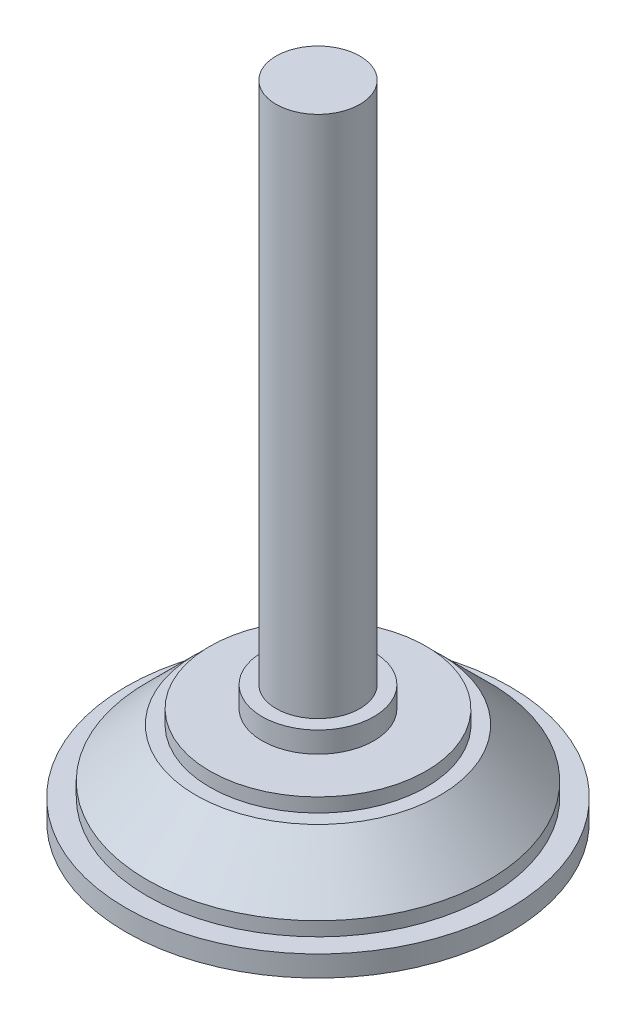
ISO-10303-21;
HEADER;
FILE_DESCRIPTION(('STEP AP214'),'2;1');
FILE_NAME('part.step','',(''),(''),'','','');
FILE_SCHEMA(('AUTOMOTIVE_DESIGN { 1 0 10303 214 1 1 1 1 }'));
ENDSEC;
DATA;
#1=APPLICATION_CONTEXT('core data for automotive mechanical design processes');
#2=APPLICATION_PROTOCOL_DEFINITION('international standard','automotive_design',2000,#1);
#3=PRODUCT_CONTEXT('',#1,'mechanical');
#4=PRODUCT('Part','Part','',(#3));
#5=PRODUCT_RELATED_PRODUCT_CATEGORY('part','',(#4));
#6=PRODUCT_DEFINITION_FORMATION('','',#4);
#7=PRODUCT_DEFINITION_CONTEXT('part definition',#1,'design');
#8=PRODUCT_DEFINITION('design','',#6,#7);
#9=PRODUCT_DEFINITION_SHAPE('','',#8);
#10=(LENGTH_UNIT() NAMED_UNIT(*) SI_UNIT(.MILLI.,.METRE.));
#11=(NAMED_UNIT(*) PLANE_ANGLE_UNIT() SI_UNIT($,.RADIAN.));
#12=(NAMED_UNIT(*) SI_UNIT($,.STERADIAN.) SOLID_ANGLE_UNIT());
#13=UNCERTAINTY_MEASURE_WITH_UNIT(LENGTH_MEASURE(1.E-05),#10,'distance_accuracy_value','');
#14=(GEOMETRIC_REPRESENTATION_CONTEXT(3) GLOBAL_UNCERTAINTY_ASSIGNED_CONTEXT((#13)) GLOBAL_UNIT_ASSIGNED_CONTEXT((#10,
#11,#12)) REPRESENTATION_CONTEXT('',''));
#15=CARTESIAN_POINT('',(0.,0.,0.));
#16=DIRECTION('',(0.,0.,1.));
#17=DIRECTION('',(1.,0.,0.));
#18=AXIS2_PLACEMENT_3D('',#15,#16,#17);
#19=CARTESIAN_POINT('',(0.,0.,0.));
#20=DIRECTION('',(0.,1.,0.));
#21=DIRECTION('',(0.,0.,1.));
#22=AXIS2_PLACEMENT_3D('',#19,#20,#21);
#23=PLANE('',#22);
#24=CARTESIAN_POINT('',(0.,0.,0.));
#25=DIRECTION('',(0.,1.,0.));
#26=DIRECTION('',(0.,0.,1.));
#27=AXIS2_PLACEMENT_3D('',#24,#25,#26);
#28=CIRCLE('',#27,27.5);
#29=CARTESIAN_POINT('',(0.,0.,27.5));
#30=VERTEX_POINT('',#29);
#31=EDGE_CURVE('E10',#30,#30,#28,.T.);
#32=ORIENTED_EDGE('',*,*,#31,.F.);
#33=EDGE_LOOP('',(#32));
#34=FACE_BOUND('',#33,.T.);
#35=ADVANCED_FACE('F34',(#34),#23,.F.);
#36=CARTESIAN_POINT('',(0.,92.,0.));
#37=DIRECTION('',(0.,1.,0.));
#38=DIRECTION('',(0.,0.,1.));
#39=AXIS2_PLACEMENT_3D('',#36,#37,#38);
#40=CYLINDRICAL_SURFACE('',#39,27.5);
#41=CARTESIAN_POINT('',(0.,3.,0.));
#42=DIRECTION('',(0.,1.,0.));
#43=DIRECTION('',(0.,0.,1.));
#44=AXIS2_PLACEMENT_3D('',#41,#42,#43);
#45=CIRCLE('',#44,27.5);
#46=CARTESIAN_POINT('',(0.,3.,27.5));
#47=VERTEX_POINT('',#46);
#48=EDGE_CURVE('E40',#47,#47,#45,.T.);
#49=ORIENTED_EDGE('',*,*,#48,.F.);
#50=EDGE_LOOP('',(#49));
#51=FACE_BOUND('',#50,.T.);
#52=ORIENTED_EDGE('',*,*,#31,.T.);
#53=EDGE_LOOP('',(#52));
#54=FACE_BOUND('',#53,.T.);
#55=ADVANCED_FACE('F127',(#51,#54),#40,.T.);
#56=CARTESIAN_POINT('',(27.5,3.,0.));
#57=DIRECTION('',(0.,-1.,0.));
#58=DIRECTION('',(0.,0.,-1.));
#59=AXIS2_PLACEMENT_3D('',#56,#57,#58);
#60=PLANE('',#59);
#61=CARTESIAN_POINT('',(0.,3.,0.));
#62=DIRECTION('',(0.,1.,0.));
#63=DIRECTION('',(0.,0.,1.));
#64=AXIS2_PLACEMENT_3D('',#61,#62,#63);
#65=CIRCLE('',#64,24.5);
#66=CARTESIAN_POINT('',(0.,3.,24.5));
#67=VERTEX_POINT('',#66);
#68=EDGE_CURVE('E44',#67,#67,#65,.T.);
#69=ORIENTED_EDGE('',*,*,#68,.F.);
#70=EDGE_LOOP('',(#69));
#71=FACE_BOUND('',#70,.T.);
#72=ORIENTED_EDGE('',*,*,#48,.T.);
#73=EDGE_LOOP('',(#72));
#74=FACE_BOUND('',#73,.T.);
#75=ADVANCED_FACE('F122',(#71,#74),#60,.F.);
#76=CARTESIAN_POINT('',(0.,92.,0.));
#77=DIRECTION('',(0.,1.,0.));
#78=DIRECTION('',(0.,0.,1.));
#79=AXIS2_PLACEMENT_3D('',#76,#77,#78);
#80=CYLINDRICAL_SURFACE('',#79,24.5);
#81=CARTESIAN_POINT('',(0.,5.,0.));
#82=DIRECTION('',(0.,1.,0.));
#83=DIRECTION('',(0.,0.,1.));
#84=AXIS2_PLACEMENT_3D('',#81,#82,#83);
#85=CIRCLE('',#84,24.5);
#86=CARTESIAN_POINT('',(0.,5.,24.5));
#87=VERTEX_POINT('',#86);
#88=EDGE_CURVE('E48',#87,#87,#85,.T.);
#89=ORIENTED_EDGE('',*,*,#88,.F.);
#90=EDGE_LOOP('',(#89));
#91=FACE_BOUND('',#90,.T.);
#92=ORIENTED_EDGE('',*,*,#68,.T.);
#93=EDGE_LOOP('',(#92));
#94=FACE_BOUND('',#93,.T.);
#95=ADVANCED_FACE('F116',(#91,#94),#80,.T.);
#96=CARTESIAN_POINT('',(0.,5.,0.));
#97=DIRECTION('',(0.,-1.,0.));
#98=DIRECTION('',(0.,0.,-1.));
#99=AXIS2_PLACEMENT_3D('',#96,#97,#98);
#100=CONICAL_SURFACE('',#99,24.5,0.785398163397451);
#101=CARTESIAN_POINT('',(0.,12.,0.));
#102=DIRECTION('',(0.,1.,0.));
#103=DIRECTION('',(0.,0.,1.));
#104=AXIS2_PLACEMENT_3D('',#101,#102,#103);
#105=CIRCLE('',#104,17.5);
#106=CARTESIAN_POINT('',(0.,12.,17.5));
#107=VERTEX_POINT('',#106);
#108=EDGE_CURVE('E53',#107,#107,#105,.T.);
#109=ORIENTED_EDGE('',*,*,#108,.F.);
#110=EDGE_LOOP('',(#109));
#111=FACE_BOUND('',#110,.T.);
#112=ORIENTED_EDGE('',*,*,#88,.T.);
#113=EDGE_LOOP('',(#112));
#114=FACE_BOUND('',#113,.T.);
#115=ADVANCED_FACE('F110',(#111,#114),#100,.T.);
#116=CARTESIAN_POINT('',(17.5,12.,0.));
#117=DIRECTION('',(0.,-1.,0.));
#118=DIRECTION('',(0.,0.,-1.));
#119=AXIS2_PLACEMENT_3D('',#116,#117,#118);
#120=PLANE('',#119);
#121=CARTESIAN_POINT('',(0.,12.,0.));
#122=DIRECTION('',(0.,1.,0.));
#123=DIRECTION('',(0.,0.,1.));
#124=AXIS2_PLACEMENT_3D('',#121,#122,#123);
#125=CIRCLE('',#124,15.5);
#126=CARTESIAN_POINT('',(0.,12.,15.5));
#127=VERTEX_POINT('',#126);
#128=EDGE_CURVE('E56',#127,#127,#125,.T.);
#129=ORIENTED_EDGE('',*,*,#128,.F.);
#130=EDGE_LOOP('',(#129));
#131=FACE_BOUND('',#130,.T.);
#132=ORIENTED_EDGE('',*,*,#108,.T.);
#133=EDGE_LOOP('',(#132));
#134=FACE_BOUND('',#133,.T.);
#135=ADVANCED_FACE('F104',(#131,#134),#120,.F.);
#136=CARTESIAN_POINT('',(0.,92.,0.));
#137=DIRECTION('',(0.,1.,0.));
#138=DIRECTION('',(0.,0.,1.));
#139=AXIS2_PLACEMENT_3D('',#136,#137,#138);
#140=CYLINDRICAL_SURFACE('',#139,15.5);
#141=CARTESIAN_POINT('',(0.,14.,0.));
#142=DIRECTION('',(0.,1.,0.));
#143=DIRECTION('',(0.,0.,1.));
#144=AXIS2_PLACEMENT_3D('',#141,#142,#143);
#145=CIRCLE('',#144,15.5);
#146=CARTESIAN_POINT('',(0.,14.,15.5));
#147=VERTEX_POINT('',#146);
#148=EDGE_CURVE('E59',#147,#147,#145,.T.);
#149=ORIENTED_EDGE('',*,*,#148,.F.);
#150=EDGE_LOOP('',(#149));
#151=FACE_BOUND('',#150,.T.);
#152=ORIENTED_EDGE('',*,*,#128,.T.);
#153=EDGE_LOOP('',(#152));
#154=FACE_BOUND('',#153,.T.);
#155=ADVANCED_FACE('F98',(#151,#154),#140,.T.);
#156=CARTESIAN_POINT('',(15.5,14.,0.));
#157=DIRECTION('',(0.,-1.,0.));
#158=DIRECTION('',(0.,0.,-1.));
#159=AXIS2_PLACEMENT_3D('',#156,#157,#158);
#160=PLANE('',#159);
#161=CARTESIAN_POINT('',(0.,14.,0.));
#162=DIRECTION('',(0.,1.,0.));
#163=DIRECTION('',(0.,0.,1.));
#164=AXIS2_PLACEMENT_3D('',#161,#162,#163);
#165=CIRCLE('',#164,8.00000000000001);
#166=CARTESIAN_POINT('',(0.,14.,8.00000000000001));
#167=VERTEX_POINT('',#166);
#168=EDGE_CURVE('E62',#167,#167,#165,.T.);
#169=ORIENTED_EDGE('',*,*,#168,.F.);
#170=EDGE_LOOP('',(#169));
#171=FACE_BOUND('',#170,.T.);
#172=ORIENTED_EDGE('',*,*,#148,.T.);
#173=EDGE_LOOP('',(#172));
#174=FACE_BOUND('',#173,.T.);
#175=ADVANCED_FACE('F92',(#171,#174),#160,.F.);
#176=CARTESIAN_POINT('',(0.,92.,0.));
#177=DIRECTION('',(0.,1.,0.));
#178=DIRECTION('',(0.,0.,1.));
#179=AXIS2_PLACEMENT_3D('',#176,#177,#178);
#180=CYLINDRICAL_SURFACE('',#179,8.00000000000001);
#181=CARTESIAN_POINT('',(0.,17.,0.));
#182=DIRECTION('',(0.,1.,0.));
#183=DIRECTION('',(0.,0.,1.));
#184=AXIS2_PLACEMENT_3D('',#181,#182,#183);
#185=CIRCLE('',#184,8.00000000000001);
#186=CARTESIAN_POINT('',(0.,17.,8.00000000000001));
#187=VERTEX_POINT('',#186);
#188=EDGE_CURVE('E65',#187,#187,#185,.T.);
#189=ORIENTED_EDGE('',*,*,#188,.F.);
#190=EDGE_LOOP('',(#189));
#191=FACE_BOUND('',#190,.T.);
#192=ORIENTED_EDGE('',*,*,#168,.T.);
#193=EDGE_LOOP('',(#192));
#194=FACE_BOUND('',#193,.T.);
#195=ADVANCED_FACE('F86',(#191,#194),#180,.T.);
#196=CARTESIAN_POINT('',(8.00000000000001,17.,0.));
#197=DIRECTION('',(0.,-1.,0.));
#198=DIRECTION('',(0.,0.,-1.));
#199=AXIS2_PLACEMENT_3D('',#196,#197,#198);
#200=PLANE('',#199);
#201=CARTESIAN_POINT('',(0.,17.,0.));
#202=DIRECTION('',(0.,1.,0.));
#203=DIRECTION('',(0.,0.,1.));
#204=AXIS2_PLACEMENT_3D('',#201,#202,#203);
#205=CIRCLE('',#204,6.00000000000001);
#206=CARTESIAN_POINT('',(0.,17.,6.00000000000001));
#207=VERTEX_POINT('',#206);
#208=EDGE_CURVE('E68',#207,#207,#205,.T.);
#209=ORIENTED_EDGE('',*,*,#208,.F.);
#210=EDGE_LOOP('',(#209));
#211=FACE_BOUND('',#210,.T.);
#212=ORIENTED_EDGE('',*,*,#188,.T.);
#213=EDGE_LOOP('',(#212));
#214=FACE_BOUND('',#213,.T.);
#215=ADVANCED_FACE('F80',(#211,#214),#200,.F.);
#216=CARTESIAN_POINT('',(0.,92.,0.));
#217=DIRECTION('',(0.,1.,0.));
#218=DIRECTION('',(0.,0.,1.));
#219=AXIS2_PLACEMENT_3D('',#216,#217,#218);
#220=CYLINDRICAL_SURFACE('',#219,6.00000000000001);
#221=CARTESIAN_POINT('',(0.,92.,0.));
#222=DIRECTION('',(0.,1.,0.));
#223=DIRECTION('',(0.,0.,1.));
#224=AXIS2_PLACEMENT_3D('',#221,#222,#223);
#225=CIRCLE('',#224,6.00000000000001);
#226=CARTESIAN_POINT('',(0.,92.,6.00000000000001));
#227=VERTEX_POINT('',#226);
#228=EDGE_CURVE('E71',#227,#227,#225,.T.);
#229=ORIENTED_EDGE('',*,*,#228,.F.);
#230=EDGE_LOOP('',(#229));
#231=FACE_BOUND('',#230,.T.);
#232=ORIENTED_EDGE('',*,*,#208,.T.);
#233=EDGE_LOOP('',(#232));
#234=FACE_BOUND('',#233,.T.);
#235=ADVANCED_FACE('F77',(#231,#234),#220,.T.);
#236=CARTESIAN_POINT('',(6.00000000000001,92.,0.));
#237=DIRECTION('',(0.,-1.,0.));
#238=DIRECTION('',(0.,0.,-1.));
#239=AXIS2_PLACEMENT_3D('',#236,#237,#238);
#240=PLANE('',#239);
#241=ORIENTED_EDGE('',*,*,#228,.T.);
#242=EDGE_LOOP('',(#241));
#243=FACE_BOUND('',#242,.T.);
#244=ADVANCED_FACE('F75',(#243),#240,.F.);
#245=CLOSED_SHELL('',(#35,#55,#75,#95,#115,#135,#155,#175,#195,#215,#235,#244));
#246=MANIFOLD_SOLID_BREP('B2',#245);
#247=ADVANCED_BREP_SHAPE_REPRESENTATION('',(#18,#246),#14);
#248=SHAPE_DEFINITION_REPRESENTATION(#9,#247);
ENDSEC;
END-ISO-10303-21;
